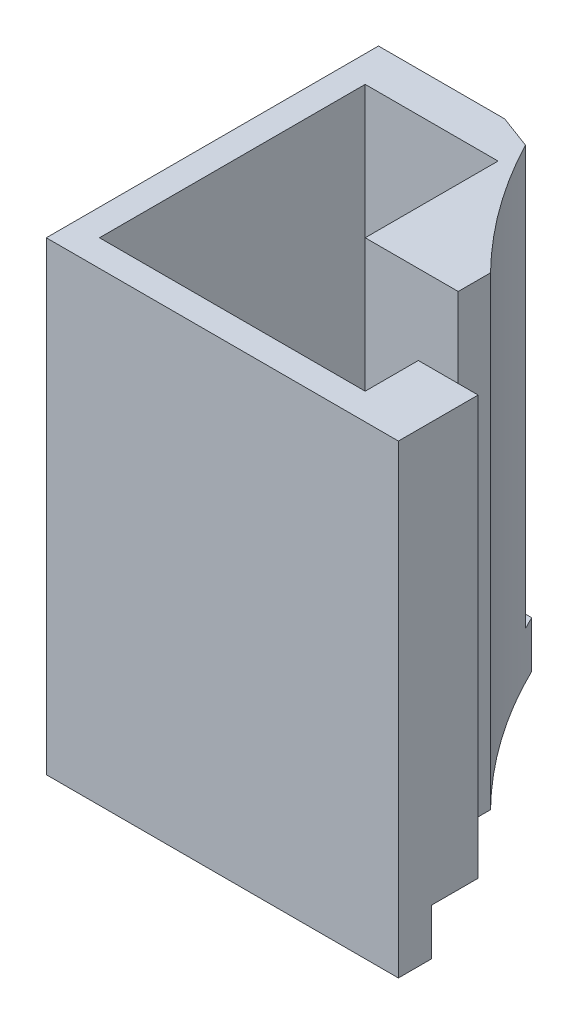
ISO-10303-21;
HEADER;
FILE_DESCRIPTION(('STEP AP214'),'2;1');
FILE_NAME('part.step','',(''),(''),'','','');
FILE_SCHEMA(('AUTOMOTIVE_DESIGN { 1 0 10303 214 1 1 1 1 }'));
ENDSEC;
DATA;
#1=APPLICATION_CONTEXT('core data for automotive mechanical design processes');
#2=APPLICATION_PROTOCOL_DEFINITION('international standard','automotive_design',2000,#1);
#3=PRODUCT_CONTEXT('',#1,'mechanical');
#4=PRODUCT('Part','Part','',(#3));
#5=PRODUCT_RELATED_PRODUCT_CATEGORY('part','',(#4));
#6=PRODUCT_DEFINITION_FORMATION('','',#4);
#7=PRODUCT_DEFINITION_CONTEXT('part definition',#1,'design');
#8=PRODUCT_DEFINITION('design','',#6,#7);
#9=PRODUCT_DEFINITION_SHAPE('','',#8);
#10=(LENGTH_UNIT() NAMED_UNIT(*) SI_UNIT(.MILLI.,.METRE.));
#11=(NAMED_UNIT(*) PLANE_ANGLE_UNIT() SI_UNIT($,.RADIAN.));
#12=(NAMED_UNIT(*) SI_UNIT($,.STERADIAN.) SOLID_ANGLE_UNIT());
#13=UNCERTAINTY_MEASURE_WITH_UNIT(LENGTH_MEASURE(1.E-05),#10,'distance_accuracy_value','');
#14=(GEOMETRIC_REPRESENTATION_CONTEXT(3) GLOBAL_UNCERTAINTY_ASSIGNED_CONTEXT((#13)) GLOBAL_UNIT_ASSIGNED_CONTEXT((#10,
#11,#12)) REPRESENTATION_CONTEXT('',''));
#15=CARTESIAN_POINT('',(0.,0.,0.));
#16=DIRECTION('',(0.,0.,1.));
#17=DIRECTION('',(1.,0.,0.));
#18=AXIS2_PLACEMENT_3D('',#15,#16,#17);
#19=CARTESIAN_POINT('',(0.,7.,0.));
#20=DIRECTION('',(0.,-1.,0.));
#21=DIRECTION('',(0.,0.,-1.));
#22=AXIS2_PLACEMENT_3D('',#19,#20,#21);
#23=PLANE('',#22);
#24=DIRECTION('',(-0.936967296794106,0.,-0.349417064177391));
#25=VECTOR('',#24,1.);
#26=CARTESIAN_POINT('',(24.,7.,-48.1353828176664));
#27=LINE('',#26,#25);
#28=CARTESIAN_POINT('',(24.,7.,-48.1353828176664));
#29=VERTEX_POINT('',#28);
#30=CARTESIAN_POINT('',(19.,7.,-50.));
#31=VERTEX_POINT('',#30);
#32=EDGE_CURVE('E219',#29,#31,#27,.T.);
#33=ORIENTED_EDGE('',*,*,#32,.F.);
#34=CARTESIAN_POINT('',(95.,7.,-85.));
#35=DIRECTION('',(0.,1.,0.));
#36=DIRECTION('',(0.,0.,1.));
#37=AXIS2_PLACEMENT_3D('',#34,#35,#36);
#38=CIRCLE('',#37,80.);
#39=CARTESIAN_POINT('',(23.0625271503092,7.,-50.));
#40=VERTEX_POINT('',#39);
#41=EDGE_CURVE('E289',#40,#29,#38,.T.);
#42=ORIENTED_EDGE('',*,*,#41,.F.);
#43=DIRECTION('',(-1.,0.,0.));
#44=VECTOR('',#43,1.);
#45=CARTESIAN_POINT('',(0.,7.,-50.));
#46=LINE('',#45,#44);
#47=EDGE_CURVE('E296',#40,#31,#46,.T.);
#48=ORIENTED_EDGE('',*,*,#47,.T.);
#49=EDGE_LOOP('',(#33,#42,#48));
#50=FACE_BOUND('',#49,.T.);
#51=ADVANCED_FACE('F77',(#50),#23,.F.);
#52=CARTESIAN_POINT('',(31.9999999999999,7.,-7.99999999999678));
#53=DIRECTION('',(0.,1.,0.));
#54=DIRECTION('',(0.,0.,1.));
#55=AXIS2_PLACEMENT_3D('',#52,#53,#54);
#56=CIRCLE('',#55,3.50000000000001);
#57=CARTESIAN_POINT('',(31.9999999999999,7.,-4.49999999999677));
#58=VERTEX_POINT('',#57);
#59=EDGE_CURVE('E271',#58,#58,#56,.T.);
#60=ORIENTED_EDGE('',*,*,#59,.F.);
#61=EDGE_LOOP('',(#60));
#62=FACE_BOUND('',#61,.T.);
#63=CARTESIAN_POINT('',(7.99999999999994,7.,-7.99999999999642));
#64=DIRECTION('',(0.,1.,0.));
#65=DIRECTION('',(0.,0.,1.));
#66=AXIS2_PLACEMENT_3D('',#63,#64,#65);
#67=CIRCLE('',#66,3.50000000000001);
#68=CARTESIAN_POINT('',(7.99999999999994,7.,-4.49999999999641));
#69=VERTEX_POINT('',#68);
#70=EDGE_CURVE('E224',#69,#69,#67,.T.);
#71=ORIENTED_EDGE('',*,*,#70,.F.);
#72=EDGE_LOOP('',(#71));
#73=FACE_BOUND('',#72,.T.);
#74=DIRECTION('',(0.,0.,1.));
#75=VECTOR('',#74,1.);
#76=CARTESIAN_POINT('',(24.,7.,0.));
#77=LINE('',#76,#75);
#78=CARTESIAN_POINT('',(24.,7.,-44.));
#79=VERTEX_POINT('',#78);
#80=CARTESIAN_POINT('',(24.,7.,-24.));
#81=VERTEX_POINT('',#80);
#82=EDGE_CURVE('E416',#79,#81,#77,.T.);
#83=ORIENTED_EDGE('',*,*,#82,.F.);
#84=DIRECTION('',(1.,0.,0.));
#85=VECTOR('',#84,1.);
#86=CARTESIAN_POINT('',(0.,7.,-44.));
#87=LINE('',#86,#85);
#88=CARTESIAN_POINT('',(4.,7.,-44.));
#89=VERTEX_POINT('',#88);
#90=EDGE_CURVE('E243',#89,#79,#87,.T.);
#91=ORIENTED_EDGE('',*,*,#90,.F.);
#92=DIRECTION('',(0.,0.,-1.));
#93=VECTOR('',#92,1.);
#94=CARTESIAN_POINT('',(4.,7.,0.));
#95=LINE('',#94,#93);
#96=CARTESIAN_POINT('',(4.,7.,-4.));
#97=VERTEX_POINT('',#96);
#98=EDGE_CURVE('E247',#97,#89,#95,.T.);
#99=ORIENTED_EDGE('',*,*,#98,.F.);
#100=DIRECTION('',(1.,0.,0.));
#101=VECTOR('',#100,1.);
#102=CARTESIAN_POINT('',(0.,7.,-4.));
#103=LINE('',#102,#101);
#104=CARTESIAN_POINT('',(44.,7.,-4.));
#105=VERTEX_POINT('',#104);
#106=EDGE_CURVE('E260',#97,#105,#103,.T.);
#107=ORIENTED_EDGE('',*,*,#106,.T.);
#108=DIRECTION('',(0.,0.,1.));
#109=VECTOR('',#108,1.);
#110=CARTESIAN_POINT('',(44.,7.,-4.));
#111=LINE('',#110,#109);
#112=CARTESIAN_POINT('',(44.,7.,-6.5));
#113=VERTEX_POINT('',#112);
#114=EDGE_CURVE('E406',#113,#105,#111,.T.);
#115=ORIENTED_EDGE('',*,*,#114,.F.);
#116=DIRECTION('',(-1.,0.,0.));
#117=VECTOR('',#116,1.);
#118=CARTESIAN_POINT('',(44.,7.,-6.5));
#119=LINE('',#118,#117);
#120=CARTESIAN_POINT('',(38.,7.,-6.5));
#121=VERTEX_POINT('',#120);
#122=EDGE_CURVE('E446',#113,#121,#119,.T.);
#123=ORIENTED_EDGE('',*,*,#122,.T.);
#124=DIRECTION('',(0.,0.,1.));
#125=VECTOR('',#124,1.);
#126=CARTESIAN_POINT('',(38.,7.,-35.));
#127=LINE('',#126,#125);
#128=CARTESIAN_POINT('',(38.,7.,-24.));
#129=VERTEX_POINT('',#128);
#130=EDGE_CURVE('E284',#129,#121,#127,.T.);
#131=ORIENTED_EDGE('',*,*,#130,.F.);
#132=DIRECTION('',(1.,0.,0.));
#133=VECTOR('',#132,1.);
#134=CARTESIAN_POINT('',(0.,7.,-24.));
#135=LINE('',#134,#133);
#136=EDGE_CURVE('E420',#81,#129,#135,.T.);
#137=ORIENTED_EDGE('',*,*,#136,.F.);
#138=EDGE_LOOP('',(#83,#91,#99,#107,#115,#123,#131,#137));
#139=FACE_BOUND('',#138,.T.);
#140=ADVANCED_FACE('F332',(#62,#73,#139),#23,.F.);
#141=CARTESIAN_POINT('',(24.,70.,0.));
#142=DIRECTION('',(1.,0.,0.));
#143=DIRECTION('',(0.,0.,-1.));
#144=AXIS2_PLACEMENT_3D('',#141,#142,#143);
#145=PLANE('',#144);
#146=DIRECTION('',(0.,-1.,0.));
#147=VECTOR('',#146,1.);
#148=CARTESIAN_POINT('',(24.,77.8102496759067,-44.));
#149=LINE('',#148,#147);
#150=CARTESIAN_POINT('',(24.,70.,-44.));
#151=VERTEX_POINT('',#150);
#152=EDGE_CURVE('E237',#151,#79,#149,.T.);
#153=ORIENTED_EDGE('',*,*,#152,.T.);
#154=ORIENTED_EDGE('',*,*,#82,.T.);
#155=DIRECTION('',(0.,-1.,0.));
#156=VECTOR('',#155,1.);
#157=CARTESIAN_POINT('',(24.,70.,-24.));
#158=LINE('',#157,#156);
#159=CARTESIAN_POINT('',(24.,70.,-24.));
#160=VERTEX_POINT('',#159);
#161=EDGE_CURVE('E250',#160,#81,#158,.T.);
#162=ORIENTED_EDGE('',*,*,#161,.F.);
#163=DIRECTION('',(0.,0.,1.));
#164=VECTOR('',#163,1.);
#165=CARTESIAN_POINT('',(24.,70.,0.));
#166=LINE('',#165,#164);
#167=EDGE_CURVE('E417',#151,#160,#166,.T.);
#168=ORIENTED_EDGE('',*,*,#167,.F.);
#169=EDGE_LOOP('',(#153,#154,#162,#168));
#170=FACE_BOUND('',#169,.T.);
#171=ADVANCED_FACE('F339',(#170),#145,.F.);
#172=CARTESIAN_POINT('',(44.,70.,-4.));
#173=DIRECTION('',(1.,0.,0.));
#174=DIRECTION('',(0.,0.,-1.));
#175=AXIS2_PLACEMENT_3D('',#172,#173,#174);
#176=PLANE('',#175);
#177=CARTESIAN_POINT('',(44.,7.,-12.));
#178=VERTEX_POINT('',#177);
#179=EDGE_CURVE('E402',#178,#113,#111,.T.);
#180=ORIENTED_EDGE('',*,*,#179,.T.);
#181=ORIENTED_EDGE('',*,*,#114,.T.);
#182=DIRECTION('',(0.,-1.,0.));
#183=VECTOR('',#182,1.);
#184=CARTESIAN_POINT('',(44.,70.,-4.));
#185=LINE('',#184,#183);
#186=CARTESIAN_POINT('',(44.,70.,-4.));
#187=VERTEX_POINT('',#186);
#188=EDGE_CURVE('E102',#187,#105,#185,.T.);
#189=ORIENTED_EDGE('',*,*,#188,.F.);
#190=DIRECTION('',(0.,0.,1.));
#191=VECTOR('',#190,1.);
#192=CARTESIAN_POINT('',(44.,70.,-4.));
#193=LINE('',#192,#191);
#194=CARTESIAN_POINT('',(44.,70.,-12.));
#195=VERTEX_POINT('',#194);
#196=EDGE_CURVE('E401',#195,#187,#193,.T.);
#197=ORIENTED_EDGE('',*,*,#196,.F.);
#198=DIRECTION('',(0.,-1.,0.));
#199=VECTOR('',#198,1.);
#200=CARTESIAN_POINT('',(44.,70.,-12.));
#201=LINE('',#200,#199);
#202=EDGE_CURVE('E410',#195,#178,#201,.T.);
#203=ORIENTED_EDGE('',*,*,#202,.T.);
#204=EDGE_LOOP('',(#180,#181,#189,#197,#203));
#205=FACE_BOUND('',#204,.T.);
#206=ADVANCED_FACE('F476',(#205),#176,.F.);
#207=CARTESIAN_POINT('',(38.,-3.,-5.));
#208=DIRECTION('',(0.,0.,1.));
#209=DIRECTION('',(1.,0.,0.));
#210=AXIS2_PLACEMENT_3D('',#207,#208,#209);
#211=PLANE('',#210);
#212=DIRECTION('',(0.,1.,0.));
#213=VECTOR('',#212,1.);
#214=CARTESIAN_POINT('',(49.,-5.22015325445528,-5.));
#215=LINE('',#214,#213);
#216=CARTESIAN_POINT('',(49.,0.,-5.));
#217=VERTEX_POINT('',#216);
#218=CARTESIAN_POINT('',(49.,7.,-5.));
#219=VERTEX_POINT('',#218);
#220=EDGE_CURVE('E388',#217,#219,#215,.T.);
#221=ORIENTED_EDGE('',*,*,#220,.T.);
#222=DIRECTION('',(-1.,0.,0.));
#223=VECTOR('',#222,1.);
#224=CARTESIAN_POINT('',(38.,7.,-5.));
#225=LINE('',#224,#223);
#226=CARTESIAN_POINT('',(53.,7.,-5.));
#227=VERTEX_POINT('',#226);
#228=EDGE_CURVE('E413',#227,#219,#225,.T.);
#229=ORIENTED_EDGE('',*,*,#228,.F.);
#230=DIRECTION('',(0.,1.,0.));
#231=VECTOR('',#230,1.);
#232=CARTESIAN_POINT('',(53.,7.,-5.));
#233=LINE('',#232,#231);
#234=CARTESIAN_POINT('',(53.,0.,-5.));
#235=VERTEX_POINT('',#234);
#236=EDGE_CURVE('E460',#235,#227,#233,.T.);
#237=ORIENTED_EDGE('',*,*,#236,.F.);
#238=DIRECTION('',(-1.,0.,0.));
#239=VECTOR('',#238,1.);
#240=CARTESIAN_POINT('',(0.,0.,-5.));
#241=LINE('',#240,#239);
#242=EDGE_CURVE('E12',#235,#217,#241,.T.);
#243=ORIENTED_EDGE('',*,*,#242,.T.);
#244=EDGE_LOOP('',(#221,#229,#237,#243));
#245=FACE_BOUND('',#244,.T.);
#246=ADVANCED_FACE('F488',(#245),#211,.F.);
#247=CARTESIAN_POINT('',(0.,7.,0.));
#248=DIRECTION('',(0.,1.,0.));
#249=DIRECTION('',(0.,0.,1.));
#250=AXIS2_PLACEMENT_3D('',#247,#248,#249);
#251=PLANE('',#250);
#252=DIRECTION('',(1.,0.,0.));
#253=VECTOR('',#252,1.);
#254=CARTESIAN_POINT('',(44.,7.,-6.5));
#255=LINE('',#254,#253);
#256=CARTESIAN_POINT('',(49.,7.,-6.5));
#257=VERTEX_POINT('',#256);
#258=EDGE_CURVE('E380',#113,#257,#255,.T.);
#259=ORIENTED_EDGE('',*,*,#258,.F.);
#260=ORIENTED_EDGE('',*,*,#179,.F.);
#261=DIRECTION('',(-1.,0.,0.));
#262=VECTOR('',#261,1.);
#263=CARTESIAN_POINT('',(50.,7.,-12.));
#264=LINE('',#263,#262);
#265=CARTESIAN_POINT('',(53.,7.,-12.));
#266=VERTEX_POINT('',#265);
#267=EDGE_CURVE('E392',#266,#178,#264,.T.);
#268=ORIENTED_EDGE('',*,*,#267,.F.);
#269=DIRECTION('',(0.,0.,-1.));
#270=VECTOR('',#269,1.);
#271=CARTESIAN_POINT('',(53.,7.,-5.));
#272=LINE('',#271,#270);
#273=EDGE_CURVE('E463',#227,#266,#272,.T.);
#274=ORIENTED_EDGE('',*,*,#273,.F.);
#275=ORIENTED_EDGE('',*,*,#228,.T.);
#276=DIRECTION('',(0.,0.,1.));
#277=VECTOR('',#276,1.);
#278=CARTESIAN_POINT('',(49.,7.,-5.));
#279=LINE('',#278,#277);
#280=EDGE_CURVE('E387',#257,#219,#279,.T.);
#281=ORIENTED_EDGE('',*,*,#280,.F.);
#282=EDGE_LOOP('',(#259,#260,#268,#274,#275,#281));
#283=FACE_BOUND('',#282,.T.);
#284=ADVANCED_FACE('F484',(#283),#251,.F.);
#285=CARTESIAN_POINT('',(0.,70.,-4.));
#286=DIRECTION('',(0.,0.,-1.));
#287=DIRECTION('',(-1.,0.,0.));
#288=AXIS2_PLACEMENT_3D('',#285,#286,#287);
#289=PLANE('',#288);
#290=DIRECTION('',(1.,0.,0.));
#291=VECTOR('',#290,1.);
#292=CARTESIAN_POINT('',(0.,70.,-4.));
#293=LINE('',#292,#291);
#294=CARTESIAN_POINT('',(4.,70.,-4.));
#295=VERTEX_POINT('',#294);
#296=EDGE_CURVE('E254',#295,#187,#293,.T.);
#297=ORIENTED_EDGE('',*,*,#296,.T.);
#298=ORIENTED_EDGE('',*,*,#188,.T.);
#299=ORIENTED_EDGE('',*,*,#106,.F.);
#300=DIRECTION('',(0.,-1.,0.));
#301=VECTOR('',#300,1.);
#302=CARTESIAN_POINT('',(4.,70.,-4.));
#303=LINE('',#302,#301);
#304=EDGE_CURVE('E225',#295,#97,#303,.T.);
#305=ORIENTED_EDGE('',*,*,#304,.F.);
#306=EDGE_LOOP('',(#297,#298,#299,#305));
#307=FACE_BOUND('',#306,.T.);
#308=ADVANCED_FACE('F358',(#307),#289,.T.);
#309=CARTESIAN_POINT('',(0.,7.,0.));
#310=DIRECTION('',(1.,0.,0.));
#311=DIRECTION('',(0.,0.,-1.));
#312=AXIS2_PLACEMENT_3D('',#309,#310,#311);
#313=PLANE('',#312);
#314=DIRECTION('',(0.,0.,1.));
#315=VECTOR('',#314,1.);
#316=CARTESIAN_POINT('',(0.,0.,0.));
#317=LINE('',#316,#315);
#318=CARTESIAN_POINT('',(0.,0.,-50.));
#319=VERTEX_POINT('',#318);
#320=CARTESIAN_POINT('',(0.,0.,0.));
#321=VERTEX_POINT('',#320);
#322=EDGE_CURVE('E295',#319,#321,#317,.T.);
#323=ORIENTED_EDGE('',*,*,#322,.T.);
#324=DIRECTION('',(0.,-1.,0.));
#325=VECTOR('',#324,1.);
#326=CARTESIAN_POINT('',(0.,7.,0.));
#327=LINE('',#326,#325);
#328=CARTESIAN_POINT('',(0.,70.,0.));
#329=VERTEX_POINT('',#328);
#330=EDGE_CURVE('E305',#329,#321,#327,.T.);
#331=ORIENTED_EDGE('',*,*,#330,.F.);
#332=DIRECTION('',(0.,0.,1.));
#333=VECTOR('',#332,1.);
#334=CARTESIAN_POINT('',(0.,70.,0.));
#335=LINE('',#334,#333);
#336=CARTESIAN_POINT('',(0.,70.,-50.));
#337=VERTEX_POINT('',#336);
#338=EDGE_CURVE('E242',#337,#329,#335,.T.);
#339=ORIENTED_EDGE('',*,*,#338,.F.);
#340=DIRECTION('',(0.,-1.,0.));
#341=VECTOR('',#340,1.);
#342=CARTESIAN_POINT('',(0.,7.,-50.));
#343=LINE('',#342,#341);
#344=EDGE_CURVE('E241',#337,#319,#343,.T.);
#345=ORIENTED_EDGE('',*,*,#344,.T.);
#346=EDGE_LOOP('',(#323,#331,#339,#345));
#347=FACE_BOUND('',#346,.T.);
#348=ADVANCED_FACE('F79',(#347),#313,.F.);
#349=CARTESIAN_POINT('',(0.,7.,0.));
#350=DIRECTION('',(0.,0.,-1.));
#351=DIRECTION('',(-1.,0.,0.));
#352=AXIS2_PLACEMENT_3D('',#349,#350,#351);
#353=PLANE('',#352);
#354=DIRECTION('',(1.,0.,0.));
#355=VECTOR('',#354,1.);
#356=CARTESIAN_POINT('',(0.,0.,0.));
#357=LINE('',#356,#355);
#358=CARTESIAN_POINT('',(53.,0.,0.));
#359=VERTEX_POINT('',#358);
#360=EDGE_CURVE('E301',#321,#359,#357,.T.);
#361=ORIENTED_EDGE('',*,*,#360,.T.);
#362=DIRECTION('',(0.,-1.,0.));
#363=VECTOR('',#362,1.);
#364=CARTESIAN_POINT('',(53.,70.,0.));
#365=LINE('',#364,#363);
#366=CARTESIAN_POINT('',(53.,70.,0.));
#367=VERTEX_POINT('',#366);
#368=EDGE_CURVE('E363',#367,#359,#365,.T.);
#369=ORIENTED_EDGE('',*,*,#368,.F.);
#370=DIRECTION('',(1.,0.,0.));
#371=VECTOR('',#370,1.);
#372=CARTESIAN_POINT('',(0.,70.,0.));
#373=LINE('',#372,#371);
#374=EDGE_CURVE('E245',#329,#367,#373,.T.);
#375=ORIENTED_EDGE('',*,*,#374,.F.);
#376=ORIENTED_EDGE('',*,*,#330,.T.);
#377=EDGE_LOOP('',(#361,#369,#375,#376));
#378=FACE_BOUND('',#377,.T.);
#379=ADVANCED_FACE('F350',(#378),#353,.F.);
#380=CARTESIAN_POINT('',(0.,7.,-50.));
#381=DIRECTION('',(0.,0.,1.));
#382=DIRECTION('',(1.,0.,0.));
#383=AXIS2_PLACEMENT_3D('',#380,#381,#382);
#384=PLANE('',#383);
#385=ORIENTED_EDGE('',*,*,#47,.F.);
#386=DIRECTION('',(0.,1.,0.));
#387=VECTOR('',#386,1.);
#388=CARTESIAN_POINT('',(23.0625271503092,-3.,-50.));
#389=LINE('',#388,#387);
#390=CARTESIAN_POINT('',(23.0625271503092,0.,-50.));
#391=VERTEX_POINT('',#390);
#392=EDGE_CURVE('E292',#40,#391,#389,.F.);
#393=ORIENTED_EDGE('',*,*,#392,.T.);
#394=DIRECTION('',(-1.,0.,0.));
#395=VECTOR('',#394,1.);
#396=CARTESIAN_POINT('',(0.,0.,-50.));
#397=LINE('',#396,#395);
#398=EDGE_CURVE('E298',#391,#319,#397,.T.);
#399=ORIENTED_EDGE('',*,*,#398,.T.);
#400=ORIENTED_EDGE('',*,*,#344,.F.);
#401=DIRECTION('',(-1.,0.,0.));
#402=VECTOR('',#401,1.);
#403=CARTESIAN_POINT('',(0.,70.,-50.));
#404=LINE('',#403,#402);
#405=CARTESIAN_POINT('',(19.,70.,-50.));
#406=VERTEX_POINT('',#405);
#407=EDGE_CURVE('E230',#406,#337,#404,.T.);
#408=ORIENTED_EDGE('',*,*,#407,.F.);
#409=DIRECTION('',(0.,-1.,0.));
#410=VECTOR('',#409,1.);
#411=CARTESIAN_POINT('',(19.,70.,-50.));
#412=LINE('',#411,#410);
#413=EDGE_CURVE('E213',#406,#31,#412,.T.);
#414=ORIENTED_EDGE('',*,*,#413,.T.);
#415=EDGE_LOOP('',(#385,#393,#399,#400,#408,#414));
#416=FACE_BOUND('',#415,.T.);
#417=ADVANCED_FACE('F239',(#416),#384,.F.);
#418=CARTESIAN_POINT('',(0.,0.,0.));
#419=DIRECTION('',(0.,-1.,0.));
#420=DIRECTION('',(0.,0.,-1.));
#421=AXIS2_PLACEMENT_3D('',#418,#419,#420);
#422=PLANE('',#421);
#423=DIRECTION('',(0.,0.,-1.));
#424=VECTOR('',#423,1.);
#425=CARTESIAN_POINT('',(38.,0.,0.));
#426=LINE('',#425,#424);
#427=CARTESIAN_POINT('',(38.,0.,-6.5));
#428=VERTEX_POINT('',#427);
#429=CARTESIAN_POINT('',(38.,0.,-28.8662311972552));
#430=VERTEX_POINT('',#429);
#431=EDGE_CURVE('E287',#428,#430,#426,.T.);
#432=ORIENTED_EDGE('',*,*,#431,.F.);
#433=DIRECTION('',(1.,0.,0.));
#434=VECTOR('',#433,1.);
#435=CARTESIAN_POINT('',(44.,0.,-6.5));
#436=LINE('',#435,#434);
#437=CARTESIAN_POINT('',(49.,0.,-6.5));
#438=VERTEX_POINT('',#437);
#439=EDGE_CURVE('E393',#428,#438,#436,.T.);
#440=ORIENTED_EDGE('',*,*,#439,.T.);
#441=DIRECTION('',(0.,0.,1.));
#442=VECTOR('',#441,1.);
#443=CARTESIAN_POINT('',(49.,0.,-5.));
#444=LINE('',#443,#442);
#445=EDGE_CURVE('E390',#438,#217,#444,.T.);
#446=ORIENTED_EDGE('',*,*,#445,.T.);
#447=ORIENTED_EDGE('',*,*,#242,.F.);
#448=DIRECTION('',(0.,0.,-1.));
#449=VECTOR('',#448,1.);
#450=CARTESIAN_POINT('',(53.,0.,0.));
#451=LINE('',#450,#449);
#452=EDGE_CURVE('E371',#359,#235,#451,.T.);
#453=ORIENTED_EDGE('',*,*,#452,.F.);
#454=ORIENTED_EDGE('',*,*,#360,.F.);
#455=ORIENTED_EDGE('',*,*,#322,.F.);
#456=ORIENTED_EDGE('',*,*,#398,.F.);
#457=CARTESIAN_POINT('',(95.,0.,-85.));
#458=DIRECTION('',(0.,-1.,0.));
#459=DIRECTION('',(0.,0.,-1.));
#460=AXIS2_PLACEMENT_3D('',#457,#458,#459);
#461=CIRCLE('',#460,80.);
#462=EDGE_CURVE('E308',#430,#391,#461,.T.);
#463=ORIENTED_EDGE('',*,*,#462,.F.);
#464=EDGE_LOOP('',(#432,#440,#446,#447,#453,#454,#455,#456,#463));
#465=FACE_BOUND('',#464,.T.);
#466=CARTESIAN_POINT('',(31.9999999999999,0.,-7.99999999999678));
#467=DIRECTION('',(0.,-1.,0.));
#468=DIRECTION('',(0.,0.,-1.));
#469=AXIS2_PLACEMENT_3D('',#466,#467,#468);
#470=CIRCLE('',#469,1.75000000000002);
#471=CARTESIAN_POINT('',(31.9999999999999,0.,-9.7499999999968));
#472=VERTEX_POINT('',#471);
#473=EDGE_CURVE('E278',#472,#472,#470,.T.);
#474=ORIENTED_EDGE('',*,*,#473,.F.);
#475=EDGE_LOOP('',(#474));
#476=FACE_BOUND('',#475,.T.);
#477=CARTESIAN_POINT('',(7.99999999999994,0.,-7.99999999999642));
#478=DIRECTION('',(0.,-1.,0.));
#479=DIRECTION('',(0.,0.,-1.));
#480=AXIS2_PLACEMENT_3D('',#477,#478,#479);
#481=CIRCLE('',#480,1.75000000000001);
#482=CARTESIAN_POINT('',(7.99999999999994,0.,-9.74999999999643));
#483=VERTEX_POINT('',#482);
#484=EDGE_CURVE('E281',#483,#483,#481,.T.);
#485=ORIENTED_EDGE('',*,*,#484,.F.);
#486=EDGE_LOOP('',(#485));
#487=FACE_BOUND('',#486,.T.);
#488=ADVANCED_FACE('F345',(#465,#476,#487),#422,.T.);
#489=CARTESIAN_POINT('',(95.,-3.,-85.));
#490=DIRECTION('',(0.,1.,0.));
#491=DIRECTION('',(0.,0.,1.));
#492=AXIS2_PLACEMENT_3D('',#489,#490,#491);
#493=CYLINDRICAL_SURFACE('',#492,80.);
#494=ORIENTED_EDGE('',*,*,#41,.T.);
#495=DIRECTION('',(0.,-1.,0.));
#496=VECTOR('',#495,1.);
#497=CARTESIAN_POINT('',(24.,70.,-48.1353828176664));
#498=LINE('',#497,#496);
#499=CARTESIAN_POINT('',(24.,70.,-48.1353828176664));
#500=VERTEX_POINT('',#499);
#501=EDGE_CURVE('E425',#500,#29,#498,.T.);
#502=ORIENTED_EDGE('',*,*,#501,.F.);
#503=CARTESIAN_POINT('',(95.,70.,-85.));
#504=DIRECTION('',(0.,1.,0.));
#505=DIRECTION('',(0.,0.,1.));
#506=AXIS2_PLACEMENT_3D('',#503,#504,#505);
#507=CIRCLE('',#506,80.);
#508=CARTESIAN_POINT('',(38.,70.,-28.8662311972552));
#509=VERTEX_POINT('',#508);
#510=EDGE_CURVE('E234',#509,#500,#507,.F.);
#511=ORIENTED_EDGE('',*,*,#510,.F.);
#512=DIRECTION('',(0.,1.,0.));
#513=VECTOR('',#512,1.);
#514=CARTESIAN_POINT('',(38.,-3.,-28.8662311972552));
#515=LINE('',#514,#513);
#516=EDGE_CURVE('E86',#509,#430,#515,.F.);
#517=ORIENTED_EDGE('',*,*,#516,.T.);
#518=ORIENTED_EDGE('',*,*,#462,.T.);
#519=ORIENTED_EDGE('',*,*,#392,.F.);
#520=EDGE_LOOP('',(#494,#502,#511,#517,#518,#519));
#521=FACE_BOUND('',#520,.T.);
#522=ADVANCED_FACE('F343',(#521),#493,.F.);
#523=CARTESIAN_POINT('',(38.,-3.,-35.));
#524=DIRECTION('',(-1.,0.,0.));
#525=DIRECTION('',(0.,0.,1.));
#526=AXIS2_PLACEMENT_3D('',#523,#524,#525);
#527=PLANE('',#526);
#528=ORIENTED_EDGE('',*,*,#130,.T.);
#529=DIRECTION('',(0.,-1.,0.));
#530=VECTOR('',#529,1.);
#531=CARTESIAN_POINT('',(38.,13.1846584384265,-6.5));
#532=LINE('',#531,#530);
#533=EDGE_CURVE('E236',#121,#428,#532,.T.);
#534=ORIENTED_EDGE('',*,*,#533,.T.);
#535=ORIENTED_EDGE('',*,*,#431,.T.);
#536=ORIENTED_EDGE('',*,*,#516,.F.);
#537=DIRECTION('',(0.,0.,-1.));
#538=VECTOR('',#537,1.);
#539=CARTESIAN_POINT('',(38.,70.,0.));
#540=LINE('',#539,#538);
#541=CARTESIAN_POINT('',(38.,70.,-24.));
#542=VERTEX_POINT('',#541);
#543=EDGE_CURVE('E422',#542,#509,#540,.T.);
#544=ORIENTED_EDGE('',*,*,#543,.F.);
#545=DIRECTION('',(0.,-1.,0.));
#546=VECTOR('',#545,1.);
#547=CARTESIAN_POINT('',(38.,70.,-24.));
#548=LINE('',#547,#546);
#549=EDGE_CURVE('E429',#542,#129,#548,.T.);
#550=ORIENTED_EDGE('',*,*,#549,.T.);
#551=EDGE_LOOP('',(#528,#534,#535,#536,#544,#550));
#552=FACE_BOUND('',#551,.T.);
#553=ADVANCED_FACE('F449',(#552),#527,.F.);
#554=CARTESIAN_POINT('',(7.99999999999994,0.,-7.99999999999642));
#555=DIRECTION('',(0.,-1.,0.));
#556=DIRECTION('',(0.,0.,-1.));
#557=AXIS2_PLACEMENT_3D('',#554,#555,#556);
#558=CYLINDRICAL_SURFACE('',#557,1.75000000000001);
#559=CARTESIAN_POINT('',(7.99999999999994,3.,-7.99999999999642));
#560=DIRECTION('',(0.,-1.,0.));
#561=DIRECTION('',(0.,0.,-1.));
#562=AXIS2_PLACEMENT_3D('',#559,#560,#561);
#563=CIRCLE('',#562,1.75000000000001);
#564=CARTESIAN_POINT('',(7.99999999999994,3.,-9.74999999999643));
#565=VERTEX_POINT('',#564);
#566=EDGE_CURVE('E81',#565,#565,#563,.F.);
#567=ORIENTED_EDGE('',*,*,#566,.T.);
#568=EDGE_LOOP('',(#567));
#569=FACE_BOUND('',#568,.T.);
#570=ORIENTED_EDGE('',*,*,#484,.T.);
#571=EDGE_LOOP('',(#570));
#572=FACE_BOUND('',#571,.T.);
#573=ADVANCED_FACE('F329',(#569,#572),#558,.F.);
#574=CARTESIAN_POINT('',(31.9999999999999,0.,-7.99999999999678));
#575=DIRECTION('',(0.,-1.,0.));
#576=DIRECTION('',(0.,0.,-1.));
#577=AXIS2_PLACEMENT_3D('',#574,#575,#576);
#578=CYLINDRICAL_SURFACE('',#577,1.75000000000002);
#579=CARTESIAN_POINT('',(31.9999999999999,3.,-7.99999999999678));
#580=DIRECTION('',(0.,-1.,0.));
#581=DIRECTION('',(0.,0.,-1.));
#582=AXIS2_PLACEMENT_3D('',#579,#580,#581);
#583=CIRCLE('',#582,1.75000000000002);
#584=CARTESIAN_POINT('',(31.9999999999999,3.,-9.7499999999968));
#585=VERTEX_POINT('',#584);
#586=EDGE_CURVE('E277',#585,#585,#583,.F.);
#587=ORIENTED_EDGE('',*,*,#586,.T.);
#588=EDGE_LOOP('',(#587));
#589=FACE_BOUND('',#588,.T.);
#590=ORIENTED_EDGE('',*,*,#473,.T.);
#591=EDGE_LOOP('',(#590));
#592=FACE_BOUND('',#591,.T.);
#593=ADVANCED_FACE('F314',(#589,#592),#578,.F.);
#594=CARTESIAN_POINT('',(31.9999999999999,3.,-7.99999999999678));
#595=DIRECTION('',(0.,-1.,0.));
#596=DIRECTION('',(0.,0.,-1.));
#597=AXIS2_PLACEMENT_3D('',#594,#595,#596);
#598=PLANE('',#597);
#599=CARTESIAN_POINT('',(31.9999999999999,3.,-7.99999999999678));
#600=DIRECTION('',(0.,1.,0.));
#601=DIRECTION('',(0.,0.,1.));
#602=AXIS2_PLACEMENT_3D('',#599,#600,#601);
#603=CIRCLE('',#602,3.50000000000001);
#604=CARTESIAN_POINT('',(31.9999999999999,3.,-4.49999999999677));
#605=VERTEX_POINT('',#604);
#606=EDGE_CURVE('E274',#605,#605,#603,.T.);
#607=ORIENTED_EDGE('',*,*,#606,.T.);
#608=EDGE_LOOP('',(#607));
#609=FACE_BOUND('',#608,.T.);
#610=ORIENTED_EDGE('',*,*,#586,.F.);
#611=EDGE_LOOP('',(#610));
#612=FACE_BOUND('',#611,.T.);
#613=ADVANCED_FACE('F317',(#609,#612),#598,.F.);
#614=CARTESIAN_POINT('',(31.9999999999999,7.,-7.99999999999678));
#615=DIRECTION('',(0.,1.,0.));
#616=DIRECTION('',(0.,0.,1.));
#617=AXIS2_PLACEMENT_3D('',#614,#615,#616);
#618=CYLINDRICAL_SURFACE('',#617,3.50000000000001);
#619=ORIENTED_EDGE('',*,*,#606,.F.);
#620=EDGE_LOOP('',(#619));
#621=FACE_BOUND('',#620,.T.);
#622=ORIENTED_EDGE('',*,*,#59,.T.);
#623=EDGE_LOOP('',(#622));
#624=FACE_BOUND('',#623,.T.);
#625=ADVANCED_FACE('F319',(#621,#624),#618,.F.);
#626=CARTESIAN_POINT('',(7.99999999999994,3.,-7.99999999999642));
#627=DIRECTION('',(0.,-1.,0.));
#628=DIRECTION('',(0.,0.,-1.));
#629=AXIS2_PLACEMENT_3D('',#626,#627,#628);
#630=PLANE('',#629);
#631=CARTESIAN_POINT('',(7.99999999999994,3.,-7.99999999999642));
#632=DIRECTION('',(0.,1.,0.));
#633=DIRECTION('',(0.,0.,1.));
#634=AXIS2_PLACEMENT_3D('',#631,#632,#633);
#635=CIRCLE('',#634,3.50000000000001);
#636=CARTESIAN_POINT('',(7.99999999999994,3.,-4.49999999999641));
#637=VERTEX_POINT('',#636);
#638=EDGE_CURVE('E268',#637,#637,#635,.T.);
#639=ORIENTED_EDGE('',*,*,#638,.T.);
#640=EDGE_LOOP('',(#639));
#641=FACE_BOUND('',#640,.T.);
#642=ORIENTED_EDGE('',*,*,#566,.F.);
#643=EDGE_LOOP('',(#642));
#644=FACE_BOUND('',#643,.T.);
#645=ADVANCED_FACE('F326',(#641,#644),#630,.F.);
#646=CARTESIAN_POINT('',(7.99999999999994,7.,-7.99999999999642));
#647=DIRECTION('',(0.,1.,0.));
#648=DIRECTION('',(0.,0.,1.));
#649=AXIS2_PLACEMENT_3D('',#646,#647,#648);
#650=CYLINDRICAL_SURFACE('',#649,3.50000000000001);
#651=ORIENTED_EDGE('',*,*,#638,.F.);
#652=EDGE_LOOP('',(#651));
#653=FACE_BOUND('',#652,.T.);
#654=ORIENTED_EDGE('',*,*,#70,.T.);
#655=EDGE_LOOP('',(#654));
#656=FACE_BOUND('',#655,.T.);
#657=ADVANCED_FACE('F641',(#653,#656),#650,.F.);
#658=CARTESIAN_POINT('',(4.,70.,0.));
#659=DIRECTION('',(-1.,0.,0.));
#660=DIRECTION('',(0.,0.,1.));
#661=AXIS2_PLACEMENT_3D('',#658,#659,#660);
#662=PLANE('',#661);
#663=ORIENTED_EDGE('',*,*,#98,.T.);
#664=DIRECTION('',(0.,-1.,0.));
#665=VECTOR('',#664,1.);
#666=CARTESIAN_POINT('',(4.,70.,-44.));
#667=LINE('',#666,#665);
#668=CARTESIAN_POINT('',(4.,70.,-44.));
#669=VERTEX_POINT('',#668);
#670=EDGE_CURVE('E259',#669,#89,#667,.T.);
#671=ORIENTED_EDGE('',*,*,#670,.F.);
#672=DIRECTION('',(0.,0.,-1.));
#673=VECTOR('',#672,1.);
#674=CARTESIAN_POINT('',(4.,70.,0.));
#675=LINE('',#674,#673);
#676=EDGE_CURVE('E256',#295,#669,#675,.T.);
#677=ORIENTED_EDGE('',*,*,#676,.F.);
#678=ORIENTED_EDGE('',*,*,#304,.T.);
#679=EDGE_LOOP('',(#663,#671,#677,#678));
#680=FACE_BOUND('',#679,.T.);
#681=ADVANCED_FACE('F518',(#680),#662,.F.);
#682=CARTESIAN_POINT('',(0.,70.,-44.));
#683=DIRECTION('',(0.,0.,-1.));
#684=DIRECTION('',(-1.,0.,0.));
#685=AXIS2_PLACEMENT_3D('',#682,#683,#684);
#686=PLANE('',#685);
#687=ORIENTED_EDGE('',*,*,#90,.T.);
#688=ORIENTED_EDGE('',*,*,#152,.F.);
#689=DIRECTION('',(1.,0.,0.));
#690=VECTOR('',#689,1.);
#691=CARTESIAN_POINT('',(0.,70.,-44.));
#692=LINE('',#691,#690);
#693=EDGE_CURVE('E94',#669,#151,#692,.T.);
#694=ORIENTED_EDGE('',*,*,#693,.F.);
#695=ORIENTED_EDGE('',*,*,#670,.T.);
#696=EDGE_LOOP('',(#687,#688,#694,#695));
#697=FACE_BOUND('',#696,.T.);
#698=ADVANCED_FACE('F514',(#697),#686,.F.);
#699=CARTESIAN_POINT('',(0.,70.,0.));
#700=DIRECTION('',(0.,1.,0.));
#701=DIRECTION('',(0.,0.,1.));
#702=AXIS2_PLACEMENT_3D('',#699,#700,#701);
#703=PLANE('',#702);
#704=ORIENTED_EDGE('',*,*,#693,.T.);
#705=ORIENTED_EDGE('',*,*,#167,.T.);
#706=DIRECTION('',(1.,0.,0.));
#707=VECTOR('',#706,1.);
#708=CARTESIAN_POINT('',(0.,70.,-24.));
#709=LINE('',#708,#707);
#710=EDGE_CURVE('E419',#160,#542,#709,.T.);
#711=ORIENTED_EDGE('',*,*,#710,.T.);
#712=ORIENTED_EDGE('',*,*,#543,.T.);
#713=ORIENTED_EDGE('',*,*,#510,.T.);
#714=DIRECTION('',(-0.936967296794106,0.,-0.349417064177391));
#715=VECTOR('',#714,1.);
#716=CARTESIAN_POINT('',(24.,70.,-48.1353828176664));
#717=LINE('',#716,#715);
#718=EDGE_CURVE('E216',#500,#406,#717,.T.);
#719=ORIENTED_EDGE('',*,*,#718,.T.);
#720=ORIENTED_EDGE('',*,*,#407,.T.);
#721=ORIENTED_EDGE('',*,*,#338,.T.);
#722=ORIENTED_EDGE('',*,*,#374,.T.);
#723=DIRECTION('',(0.,0.,1.));
#724=VECTOR('',#723,1.);
#725=CARTESIAN_POINT('',(53.,70.,-12.));
#726=LINE('',#725,#724);
#727=CARTESIAN_POINT('',(53.,70.,-12.));
#728=VERTEX_POINT('',#727);
#729=EDGE_CURVE('E375',#728,#367,#726,.T.);
#730=ORIENTED_EDGE('',*,*,#729,.F.);
#731=DIRECTION('',(-1.,0.,0.));
#732=VECTOR('',#731,1.);
#733=CARTESIAN_POINT('',(50.,70.,-12.));
#734=LINE('',#733,#732);
#735=EDGE_CURVE('E399',#728,#195,#734,.T.);
#736=ORIENTED_EDGE('',*,*,#735,.T.);
#737=ORIENTED_EDGE('',*,*,#196,.T.);
#738=ORIENTED_EDGE('',*,*,#296,.F.);
#739=ORIENTED_EDGE('',*,*,#676,.T.);
#740=EDGE_LOOP('',(#704,#705,#711,#712,#713,#719,#720,#721,#722,#730,#736,#737,#738,#739));
#741=FACE_BOUND('',#740,.T.);
#742=ADVANCED_FACE('F228',(#741),#703,.T.);
#743=CARTESIAN_POINT('',(0.,70.,-24.));
#744=DIRECTION('',(0.,0.,-1.));
#745=DIRECTION('',(-1.,0.,0.));
#746=AXIS2_PLACEMENT_3D('',#743,#744,#745);
#747=PLANE('',#746);
#748=ORIENTED_EDGE('',*,*,#136,.T.);
#749=ORIENTED_EDGE('',*,*,#549,.F.);
#750=ORIENTED_EDGE('',*,*,#710,.F.);
#751=ORIENTED_EDGE('',*,*,#161,.T.);
#752=EDGE_LOOP('',(#748,#749,#750,#751));
#753=FACE_BOUND('',#752,.T.);
#754=ADVANCED_FACE('F438',(#753),#747,.F.);
#755=CARTESIAN_POINT('',(50.,70.,-12.));
#756=DIRECTION('',(0.,0.,1.));
#757=DIRECTION('',(1.,0.,0.));
#758=AXIS2_PLACEMENT_3D('',#755,#756,#757);
#759=PLANE('',#758);
#760=ORIENTED_EDGE('',*,*,#267,.T.);
#761=ORIENTED_EDGE('',*,*,#202,.F.);
#762=ORIENTED_EDGE('',*,*,#735,.F.);
#763=DIRECTION('',(0.,1.,0.));
#764=VECTOR('',#763,1.);
#765=CARTESIAN_POINT('',(53.,7.,-12.));
#766=LINE('',#765,#764);
#767=EDGE_CURVE('E466',#266,#728,#766,.T.);
#768=ORIENTED_EDGE('',*,*,#767,.F.);
#769=EDGE_LOOP('',(#760,#761,#762,#768));
#770=FACE_BOUND('',#769,.T.);
#771=ADVANCED_FACE('F473',(#770),#759,.F.);
#772=CARTESIAN_POINT('',(44.,-5.22015325445528,-6.5));
#773=DIRECTION('',(0.,0.,1.));
#774=DIRECTION('',(1.,0.,0.));
#775=AXIS2_PLACEMENT_3D('',#772,#773,#774);
#776=PLANE('',#775);
#777=ORIENTED_EDGE('',*,*,#439,.F.);
#778=ORIENTED_EDGE('',*,*,#533,.F.);
#779=ORIENTED_EDGE('',*,*,#122,.F.);
#780=ORIENTED_EDGE('',*,*,#258,.T.);
#781=DIRECTION('',(0.,1.,0.));
#782=VECTOR('',#781,1.);
#783=CARTESIAN_POINT('',(49.,-5.22015325445528,-6.5));
#784=LINE('',#783,#782);
#785=EDGE_CURVE('E383',#438,#257,#784,.T.);
#786=ORIENTED_EDGE('',*,*,#785,.F.);
#787=EDGE_LOOP('',(#777,#778,#779,#780,#786));
#788=FACE_BOUND('',#787,.T.);
#789=ADVANCED_FACE('F480',(#788),#776,.F.);
#790=CARTESIAN_POINT('',(49.,-5.22015325445528,-5.));
#791=DIRECTION('',(-1.,0.,0.));
#792=DIRECTION('',(0.,0.,1.));
#793=AXIS2_PLACEMENT_3D('',#790,#791,#792);
#794=PLANE('',#793);
#795=ORIENTED_EDGE('',*,*,#445,.F.);
#796=ORIENTED_EDGE('',*,*,#785,.T.);
#797=ORIENTED_EDGE('',*,*,#280,.T.);
#798=ORIENTED_EDGE('',*,*,#220,.F.);
#799=EDGE_LOOP('',(#795,#796,#797,#798));
#800=FACE_BOUND('',#799,.T.);
#801=ADVANCED_FACE('F486',(#800),#794,.F.);
#802=CARTESIAN_POINT('',(53.,0.,0.));
#803=DIRECTION('',(1.,0.,0.));
#804=DIRECTION('',(0.,0.,-1.));
#805=AXIS2_PLACEMENT_3D('',#802,#803,#804);
#806=PLANE('',#805);
#807=ORIENTED_EDGE('',*,*,#236,.T.);
#808=ORIENTED_EDGE('',*,*,#273,.T.);
#809=ORIENTED_EDGE('',*,*,#767,.T.);
#810=ORIENTED_EDGE('',*,*,#729,.T.);
#811=ORIENTED_EDGE('',*,*,#368,.T.);
#812=ORIENTED_EDGE('',*,*,#452,.T.);
#813=EDGE_LOOP('',(#807,#808,#809,#810,#811,#812));
#814=FACE_BOUND('',#813,.T.);
#815=ADVANCED_FACE('F370',(#814),#806,.T.);
#816=CARTESIAN_POINT('',(24.,77.8102496759067,-48.1353828176664));
#817=DIRECTION('',(-0.349417064177391,0.,0.936967296794105));
#818=DIRECTION('',(0.936967296794106,0.,0.349417064177391));
#819=AXIS2_PLACEMENT_3D('',#816,#817,#818);
#820=PLANE('',#819);
#821=ORIENTED_EDGE('',*,*,#718,.F.);
#822=ORIENTED_EDGE('',*,*,#501,.T.);
#823=ORIENTED_EDGE('',*,*,#32,.T.);
#824=ORIENTED_EDGE('',*,*,#413,.F.);
#825=EDGE_LOOP('',(#821,#822,#823,#824));
#826=FACE_BOUND('',#825,.T.);
#827=ADVANCED_FACE('F215',(#826),#820,.F.);
#828=CLOSED_SHELL('',(#51,#140,#171,#206,#246,#284,#308,#348,#379,#417,#488,#522,#553,#573,#593,
#613,#625,#645,#657,#681,#698,#742,#754,#771,#789,#801,#815,#827));
#829=MANIFOLD_SOLID_BREP('B2',#828);
#830=ADVANCED_BREP_SHAPE_REPRESENTATION('',(#18,#829),#14);
#831=SHAPE_DEFINITION_REPRESENTATION(#9,#830);
ENDSEC;
END-ISO-10303-21;
